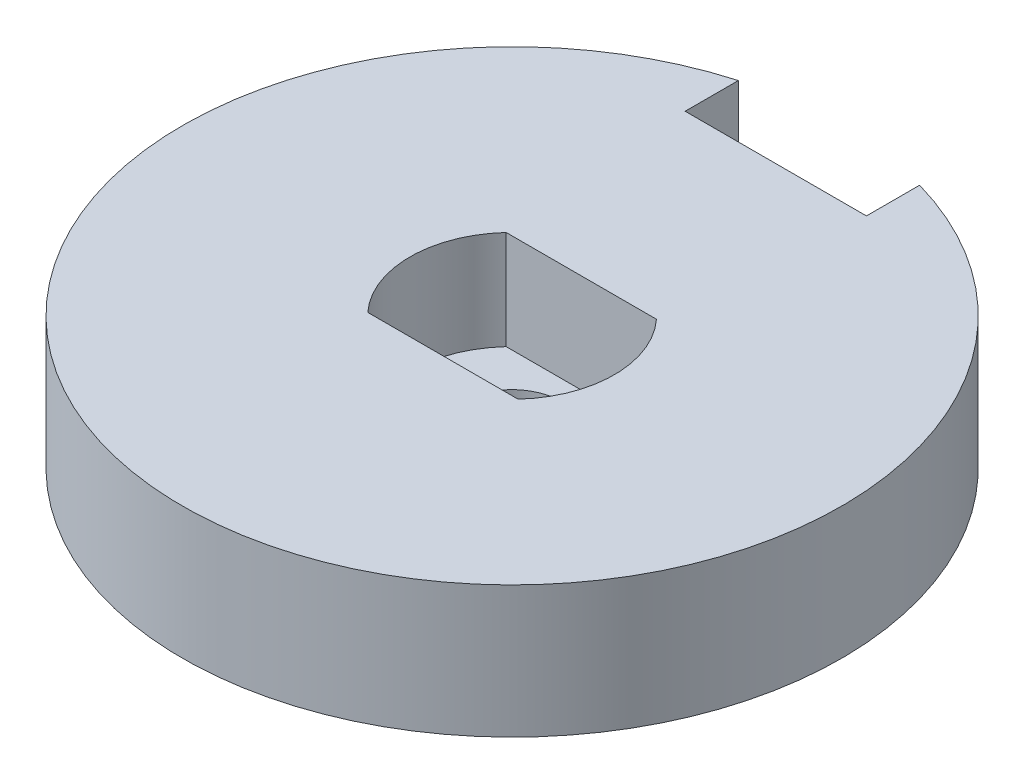
ISO-10303-21;
HEADER;
FILE_DESCRIPTION(('STEP AP214'),'2;1');
FILE_NAME('part.step','',(''),(''),'','','');
FILE_SCHEMA(('AUTOMOTIVE_DESIGN { 1 0 10303 214 1 1 1 1 }'));
ENDSEC;
DATA;
#1=APPLICATION_CONTEXT('core data for automotive mechanical design processes');
#2=APPLICATION_PROTOCOL_DEFINITION('international standard','automotive_design',2000,#1);
#3=PRODUCT_CONTEXT('',#1,'mechanical');
#4=PRODUCT('Part','Part','',(#3));
#5=PRODUCT_RELATED_PRODUCT_CATEGORY('part','',(#4));
#6=PRODUCT_DEFINITION_FORMATION('','',#4);
#7=PRODUCT_DEFINITION_CONTEXT('part definition',#1,'design');
#8=PRODUCT_DEFINITION('design','',#6,#7);
#9=PRODUCT_DEFINITION_SHAPE('','',#8);
#10=(LENGTH_UNIT() NAMED_UNIT(*) SI_UNIT(.MILLI.,.METRE.));
#11=(NAMED_UNIT(*) PLANE_ANGLE_UNIT() SI_UNIT($,.RADIAN.));
#12=(NAMED_UNIT(*) SI_UNIT($,.STERADIAN.) SOLID_ANGLE_UNIT());
#13=UNCERTAINTY_MEASURE_WITH_UNIT(LENGTH_MEASURE(1.E-05),#10,'distance_accuracy_value','');
#14=(GEOMETRIC_REPRESENTATION_CONTEXT(3) GLOBAL_UNCERTAINTY_ASSIGNED_CONTEXT((#13)) GLOBAL_UNIT_ASSIGNED_CONTEXT((#10,
#11,#12)) REPRESENTATION_CONTEXT('',''));
#15=CARTESIAN_POINT('',(0.,0.,0.));
#16=DIRECTION('',(0.,0.,1.));
#17=DIRECTION('',(1.,0.,0.));
#18=AXIS2_PLACEMENT_3D('',#15,#16,#17);
#19=CARTESIAN_POINT('',(0.,3.5,0.));
#20=DIRECTION('',(0.,1.,0.));
#21=DIRECTION('',(0.,0.,1.));
#22=AXIS2_PLACEMENT_3D('',#19,#20,#21);
#23=PLANE('',#22);
#24=DIRECTION('',(0.684347525543312,0.,0.729155994477687));
#25=VECTOR('',#24,1.);
#26=CARTESIAN_POINT('',(-3.37279266770812,3.5,0.790107347551172));
#27=LINE('',#26,#25);
#28=CARTESIAN_POINT('',(-3.37279266770812,3.5,0.790107347551172));
#29=VERTEX_POINT('',#28);
#30=CARTESIAN_POINT('',(-1.002143299158,3.5,3.3159778057087));
#31=VERTEX_POINT('',#30);
#32=EDGE_CURVE('E270',#29,#31,#27,.T.);
#33=ORIENTED_EDGE('',*,*,#32,.T.);
#34=DIRECTION('',(0.973641377311039,0.,-0.228084344898685));
#35=VECTOR('',#34,1.);
#36=CARTESIAN_POINT('',(-1.002143299158,3.5,3.3159778057087));
#37=LINE('',#36,#35);
#38=CARTESIAN_POINT('',(2.37064936855012,3.5,2.52587045815753));
#39=VERTEX_POINT('',#38);
#40=EDGE_CURVE('E254',#31,#39,#37,.T.);
#41=ORIENTED_EDGE('',*,*,#40,.T.);
#42=DIRECTION('',(0.289293851767726,0.,-0.957240339376373));
#43=VECTOR('',#42,1.);
#44=CARTESIAN_POINT('',(2.37064936855012,3.5,2.52587045815753));
#45=LINE('',#44,#43);
#46=CARTESIAN_POINT('',(3.37279266770812,3.5,-0.790107347551173));
#47=VERTEX_POINT('',#46);
#48=EDGE_CURVE('E257',#39,#47,#45,.T.);
#49=ORIENTED_EDGE('',*,*,#48,.T.);
#50=DIRECTION('',(-0.684347525543313,0.,-0.729155994477687));
#51=VECTOR('',#50,1.);
#52=CARTESIAN_POINT('',(3.37279266770812,3.5,-0.790107347551173));
#53=LINE('',#52,#51);
#54=CARTESIAN_POINT('',(1.002143299158,3.5,-3.3159778057087));
#55=VERTEX_POINT('',#54);
#56=EDGE_CURVE('E261',#47,#55,#53,.T.);
#57=ORIENTED_EDGE('',*,*,#56,.T.);
#58=DIRECTION('',(-0.973641377311039,0.,0.228084344898685));
#59=VECTOR('',#58,1.);
#60=CARTESIAN_POINT('',(1.002143299158,3.5,-3.3159778057087));
#61=LINE('',#60,#59);
#62=CARTESIAN_POINT('',(-2.37064936855011,3.5,-2.52587045815753));
#63=VERTEX_POINT('',#62);
#64=EDGE_CURVE('E264',#55,#63,#61,.T.);
#65=ORIENTED_EDGE('',*,*,#64,.T.);
#66=DIRECTION('',(-0.289293851767727,0.,0.957240339376372));
#67=VECTOR('',#66,1.);
#68=CARTESIAN_POINT('',(-2.37064936855011,3.5,-2.52587045815753));
#69=LINE('',#68,#67);
#70=EDGE_CURVE('E267',#63,#29,#69,.T.);
#71=ORIENTED_EDGE('',*,*,#70,.T.);
#72=EDGE_LOOP('',(#33,#41,#49,#57,#65,#71));
#73=FACE_BOUND('',#72,.T.);
#74=DIRECTION('',(0.,0.,1.));
#75=VECTOR('',#74,1.);
#76=CARTESIAN_POINT('',(-2.,3.5,-3.5));
#77=LINE('',#76,#75);
#78=CARTESIAN_POINT('',(-2.,3.5,-8.));
#79=VERTEX_POINT('',#78);
#80=CARTESIAN_POINT('',(-2.,3.5,-3.5));
#81=VERTEX_POINT('',#80);
#82=EDGE_CURVE('E372',#79,#81,#77,.T.);
#83=ORIENTED_EDGE('',*,*,#82,.T.);
#84=DIRECTION('',(1.,0.,0.));
#85=VECTOR('',#84,1.);
#86=CARTESIAN_POINT('',(-2.,3.5,-3.5));
#87=LINE('',#86,#85);
#88=CARTESIAN_POINT('',(2.,3.5,-3.5));
#89=VERTEX_POINT('',#88);
#90=EDGE_CURVE('E378',#81,#89,#87,.T.);
#91=ORIENTED_EDGE('',*,*,#90,.T.);
#92=DIRECTION('',(0.,0.,-1.));
#93=VECTOR('',#92,1.);
#94=CARTESIAN_POINT('',(2.,3.5,-3.5));
#95=LINE('',#94,#93);
#96=CARTESIAN_POINT('',(2.,3.5,-8.));
#97=VERTEX_POINT('',#96);
#98=EDGE_CURVE('E365',#89,#97,#95,.T.);
#99=ORIENTED_EDGE('',*,*,#98,.T.);
#100=DIRECTION('',(-1.,0.,0.));
#101=VECTOR('',#100,1.);
#102=CARTESIAN_POINT('',(-2.75,3.5,-8.));
#103=LINE('',#102,#101);
#104=CARTESIAN_POINT('',(2.75,3.5,-8.));
#105=VERTEX_POINT('',#104);
#106=EDGE_CURVE('E183',#105,#97,#103,.T.);
#107=ORIENTED_EDGE('',*,*,#106,.F.);
#108=DIRECTION('',(0.,0.,1.));
#109=VECTOR('',#108,1.);
#110=CARTESIAN_POINT('',(2.75,3.5,-8.));
#111=LINE('',#110,#109);
#112=CARTESIAN_POINT('',(2.75,3.5,-9.61444226151471));
#113=VERTEX_POINT('',#112);
#114=EDGE_CURVE('E224',#113,#105,#111,.T.);
#115=ORIENTED_EDGE('',*,*,#114,.F.);
#116=CARTESIAN_POINT('',(0.,3.5,0.));
#117=DIRECTION('',(0.,1.,0.));
#118=DIRECTION('',(0.,0.,1.));
#119=AXIS2_PLACEMENT_3D('',#116,#117,#118);
#120=CIRCLE('',#119,10.);
#121=CARTESIAN_POINT('',(-2.75,3.5,-9.61444226151471));
#122=VERTEX_POINT('',#121);
#123=EDGE_CURVE('E229',#122,#113,#120,.T.);
#124=ORIENTED_EDGE('',*,*,#123,.F.);
#125=DIRECTION('',(0.,0.,-1.));
#126=VECTOR('',#125,1.);
#127=CARTESIAN_POINT('',(-2.75,3.5,-8.));
#128=LINE('',#127,#126);
#129=CARTESIAN_POINT('',(-2.75,3.5,-8.));
#130=VERTEX_POINT('',#129);
#131=EDGE_CURVE('E240',#130,#122,#128,.T.);
#132=ORIENTED_EDGE('',*,*,#131,.F.);
#133=EDGE_CURVE('E238',#79,#130,#103,.T.);
#134=ORIENTED_EDGE('',*,*,#133,.F.);
#135=EDGE_LOOP('',(#83,#91,#99,#107,#115,#124,#132,#134));
#136=FACE_BOUND('',#135,.T.);
#137=ADVANCED_FACE('F37',(#73,#136),#23,.F.);
#138=CARTESIAN_POINT('',(-2.75,7.5,-8.));
#139=DIRECTION('',(0.,0.,1.));
#140=DIRECTION('',(1.,0.,0.));
#141=AXIS2_PLACEMENT_3D('',#138,#139,#140);
#142=PLANE('',#141);
#143=DIRECTION('',(0.,-1.,0.));
#144=VECTOR('',#143,1.);
#145=CARTESIAN_POINT('',(-2.75,7.5,-8.));
#146=LINE('',#145,#144);
#147=CARTESIAN_POINT('',(-2.75,7.5,-8.));
#148=VERTEX_POINT('',#147);
#149=EDGE_CURVE('E248',#148,#130,#146,.T.);
#150=ORIENTED_EDGE('',*,*,#149,.F.);
#151=DIRECTION('',(-1.,0.,0.));
#152=VECTOR('',#151,1.);
#153=CARTESIAN_POINT('',(-2.75,7.5,-8.));
#154=LINE('',#153,#152);
#155=CARTESIAN_POINT('',(2.75,7.5,-8.));
#156=VERTEX_POINT('',#155);
#157=EDGE_CURVE('E228',#156,#148,#154,.T.);
#158=ORIENTED_EDGE('',*,*,#157,.F.);
#159=DIRECTION('',(0.,-1.,0.));
#160=VECTOR('',#159,1.);
#161=CARTESIAN_POINT('',(2.75,7.5,-8.));
#162=LINE('',#161,#160);
#163=EDGE_CURVE('E251',#156,#105,#162,.T.);
#164=ORIENTED_EDGE('',*,*,#163,.T.);
#165=ORIENTED_EDGE('',*,*,#106,.T.);
#166=DIRECTION('',(0.,-1.,0.));
#167=VECTOR('',#166,1.);
#168=CARTESIAN_POINT('',(2.,4.4,-8.));
#169=LINE('',#168,#167);
#170=CARTESIAN_POINT('',(2.,4.4,-8.));
#171=VERTEX_POINT('',#170);
#172=EDGE_CURVE('E168',#171,#97,#169,.T.);
#173=ORIENTED_EDGE('',*,*,#172,.F.);
#174=DIRECTION('',(-1.,0.,0.));
#175=VECTOR('',#174,1.);
#176=CARTESIAN_POINT('',(2.,4.4,-8.));
#177=LINE('',#176,#175);
#178=CARTESIAN_POINT('',(-2.,4.4,-8.));
#179=VERTEX_POINT('',#178);
#180=EDGE_CURVE('E172',#171,#179,#177,.T.);
#181=ORIENTED_EDGE('',*,*,#180,.T.);
#182=DIRECTION('',(0.,-1.,0.));
#183=VECTOR('',#182,1.);
#184=CARTESIAN_POINT('',(-2.,4.4,-8.));
#185=LINE('',#184,#183);
#186=EDGE_CURVE('E184',#179,#79,#185,.T.);
#187=ORIENTED_EDGE('',*,*,#186,.T.);
#188=ORIENTED_EDGE('',*,*,#133,.T.);
#189=EDGE_LOOP('',(#150,#158,#164,#165,#173,#181,#187,#188));
#190=FACE_BOUND('',#189,.T.);
#191=ADVANCED_FACE('F181',(#190),#142,.F.);
#192=CARTESIAN_POINT('',(-1.002143299158,3.5,3.3159778057087));
#193=DIRECTION('',(-0.228084344898685,0.,-0.973641377311039));
#194=DIRECTION('',(-0.973641377311039,0.,0.228084344898685));
#195=AXIS2_PLACEMENT_3D('',#192,#193,#194);
#196=PLANE('',#195);
#197=DIRECTION('',(0.973641377311039,0.,-0.228084344898685));
#198=VECTOR('',#197,1.);
#199=CARTESIAN_POINT('',(-1.002143299158,0.,3.3159778057087));
#200=LINE('',#199,#198);
#201=CARTESIAN_POINT('',(-1.002143299158,0.,3.3159778057087));
#202=VERTEX_POINT('',#201);
#203=CARTESIAN_POINT('',(2.37064936855012,0.,2.52587045815753));
#204=VERTEX_POINT('',#203);
#205=EDGE_CURVE('E253',#202,#204,#200,.T.);
#206=ORIENTED_EDGE('',*,*,#205,.T.);
#207=DIRECTION('',(0.,-1.,0.));
#208=VECTOR('',#207,1.);
#209=CARTESIAN_POINT('',(2.37064936855012,3.5,2.52587045815753));
#210=LINE('',#209,#208);
#211=EDGE_CURVE('E11',#39,#204,#210,.T.);
#212=ORIENTED_EDGE('',*,*,#211,.F.);
#213=ORIENTED_EDGE('',*,*,#40,.F.);
#214=DIRECTION('',(0.,-1.,0.));
#215=VECTOR('',#214,1.);
#216=CARTESIAN_POINT('',(-1.002143299158,3.5,3.3159778057087));
#217=LINE('',#216,#215);
#218=EDGE_CURVE('E273',#31,#202,#217,.T.);
#219=ORIENTED_EDGE('',*,*,#218,.T.);
#220=EDGE_LOOP('',(#206,#212,#213,#219));
#221=FACE_BOUND('',#220,.T.);
#222=ADVANCED_FACE('F39',(#221),#196,.F.);
#223=CARTESIAN_POINT('',(2.37064936855012,3.5,2.52587045815753));
#224=DIRECTION('',(-0.957240339376373,0.,-0.289293851767726));
#225=DIRECTION('',(-0.289293851767726,0.,0.957240339376373));
#226=AXIS2_PLACEMENT_3D('',#223,#224,#225);
#227=PLANE('',#226);
#228=DIRECTION('',(0.289293851767726,0.,-0.957240339376373));
#229=VECTOR('',#228,1.);
#230=CARTESIAN_POINT('',(2.37064936855012,0.,2.52587045815753));
#231=LINE('',#230,#229);
#232=CARTESIAN_POINT('',(3.37279266770812,0.,-0.790107347551173));
#233=VERTEX_POINT('',#232);
#234=EDGE_CURVE('E276',#204,#233,#231,.T.);
#235=ORIENTED_EDGE('',*,*,#234,.T.);
#236=DIRECTION('',(0.,-1.,0.));
#237=VECTOR('',#236,1.);
#238=CARTESIAN_POINT('',(3.37279266770812,3.5,-0.790107347551173));
#239=LINE('',#238,#237);
#240=EDGE_CURVE('E46',#47,#233,#239,.T.);
#241=ORIENTED_EDGE('',*,*,#240,.F.);
#242=ORIENTED_EDGE('',*,*,#48,.F.);
#243=ORIENTED_EDGE('',*,*,#211,.T.);
#244=EDGE_LOOP('',(#235,#241,#242,#243));
#245=FACE_BOUND('',#244,.T.);
#246=ADVANCED_FACE('F318',(#245),#227,.F.);
#247=CARTESIAN_POINT('',(3.37279266770812,3.5,-0.790107347551173));
#248=DIRECTION('',(-0.729155994477687,0.,0.684347525543313));
#249=DIRECTION('',(0.684347525543313,0.,0.729155994477687));
#250=AXIS2_PLACEMENT_3D('',#247,#248,#249);
#251=PLANE('',#250);
#252=DIRECTION('',(-0.684347525543313,0.,-0.729155994477687));
#253=VECTOR('',#252,1.);
#254=CARTESIAN_POINT('',(3.37279266770812,0.,-0.790107347551173));
#255=LINE('',#254,#253);
#256=CARTESIAN_POINT('',(1.002143299158,0.,-3.3159778057087));
#257=VERTEX_POINT('',#256);
#258=EDGE_CURVE('E278',#233,#257,#255,.T.);
#259=ORIENTED_EDGE('',*,*,#258,.T.);
#260=DIRECTION('',(0.,-1.,0.));
#261=VECTOR('',#260,1.);
#262=CARTESIAN_POINT('',(1.002143299158,3.5,-3.3159778057087));
#263=LINE('',#262,#261);
#264=EDGE_CURVE('E293',#55,#257,#263,.T.);
#265=ORIENTED_EDGE('',*,*,#264,.F.);
#266=ORIENTED_EDGE('',*,*,#56,.F.);
#267=ORIENTED_EDGE('',*,*,#240,.T.);
#268=EDGE_LOOP('',(#259,#265,#266,#267));
#269=FACE_BOUND('',#268,.T.);
#270=ADVANCED_FACE('F300',(#269),#251,.F.);
#271=CARTESIAN_POINT('',(1.002143299158,3.5,-3.3159778057087));
#272=DIRECTION('',(0.228084344898685,0.,0.973641377311039));
#273=DIRECTION('',(0.97364137731104,0.,-0.228084344898685));
#274=AXIS2_PLACEMENT_3D('',#271,#272,#273);
#275=PLANE('',#274);
#276=DIRECTION('',(-0.973641377311039,0.,0.228084344898685));
#277=VECTOR('',#276,1.);
#278=CARTESIAN_POINT('',(1.002143299158,0.,-3.3159778057087));
#279=LINE('',#278,#277);
#280=CARTESIAN_POINT('',(-2.37064936855011,0.,-2.52587045815753));
#281=VERTEX_POINT('',#280);
#282=EDGE_CURVE('E280',#257,#281,#279,.T.);
#283=ORIENTED_EDGE('',*,*,#282,.T.);
#284=DIRECTION('',(0.,-1.,0.));
#285=VECTOR('',#284,1.);
#286=CARTESIAN_POINT('',(-2.37064936855011,3.5,-2.52587045815753));
#287=LINE('',#286,#285);
#288=EDGE_CURVE('E290',#63,#281,#287,.T.);
#289=ORIENTED_EDGE('',*,*,#288,.F.);
#290=ORIENTED_EDGE('',*,*,#64,.F.);
#291=ORIENTED_EDGE('',*,*,#264,.T.);
#292=EDGE_LOOP('',(#283,#289,#290,#291));
#293=FACE_BOUND('',#292,.T.);
#294=ADVANCED_FACE('F309',(#293),#275,.F.);
#295=CARTESIAN_POINT('',(-2.37064936855011,3.5,-2.52587045815753));
#296=DIRECTION('',(0.957240339376372,0.,0.289293851767727));
#297=DIRECTION('',(0.289293851767727,0.,-0.957240339376373));
#298=AXIS2_PLACEMENT_3D('',#295,#296,#297);
#299=PLANE('',#298);
#300=DIRECTION('',(-0.289293851767727,0.,0.957240339376372));
#301=VECTOR('',#300,1.);
#302=CARTESIAN_POINT('',(-2.37064936855011,0.,-2.52587045815753));
#303=LINE('',#302,#301);
#304=CARTESIAN_POINT('',(-3.37279266770812,0.,0.790107347551172));
#305=VERTEX_POINT('',#304);
#306=EDGE_CURVE('E282',#281,#305,#303,.T.);
#307=ORIENTED_EDGE('',*,*,#306,.T.);
#308=DIRECTION('',(0.,-1.,0.));
#309=VECTOR('',#308,1.);
#310=CARTESIAN_POINT('',(-3.37279266770812,3.5,0.790107347551172));
#311=LINE('',#310,#309);
#312=EDGE_CURVE('E287',#29,#305,#311,.T.);
#313=ORIENTED_EDGE('',*,*,#312,.F.);
#314=ORIENTED_EDGE('',*,*,#70,.F.);
#315=ORIENTED_EDGE('',*,*,#288,.T.);
#316=EDGE_LOOP('',(#307,#313,#314,#315));
#317=FACE_BOUND('',#316,.T.);
#318=ADVANCED_FACE('F313',(#317),#299,.F.);
#319=CARTESIAN_POINT('',(-3.37279266770812,3.5,0.790107347551172));
#320=DIRECTION('',(0.729155994477687,0.,-0.684347525543312));
#321=DIRECTION('',(-0.684347525543313,0.,-0.729155994477687));
#322=AXIS2_PLACEMENT_3D('',#319,#320,#321);
#323=PLANE('',#322);
#324=DIRECTION('',(0.684347525543312,0.,0.729155994477687));
#325=VECTOR('',#324,1.);
#326=CARTESIAN_POINT('',(-3.37279266770812,0.,0.790107347551172));
#327=LINE('',#326,#325);
#328=EDGE_CURVE('E258',#305,#202,#327,.T.);
#329=ORIENTED_EDGE('',*,*,#328,.T.);
#330=ORIENTED_EDGE('',*,*,#218,.F.);
#331=ORIENTED_EDGE('',*,*,#32,.F.);
#332=ORIENTED_EDGE('',*,*,#312,.T.);
#333=EDGE_LOOP('',(#329,#330,#331,#332));
#334=FACE_BOUND('',#333,.T.);
#335=ADVANCED_FACE('F322',(#334),#323,.F.);
#336=CARTESIAN_POINT('',(0.,0.,0.));
#337=DIRECTION('',(0.,1.,0.));
#338=DIRECTION('',(0.,0.,1.));
#339=AXIS2_PLACEMENT_3D('',#336,#337,#338);
#340=PLANE('',#339);
#341=CARTESIAN_POINT('',(0.,0.,0.));
#342=DIRECTION('',(0.,-1.,0.));
#343=DIRECTION('',(0.,0.,-1.));
#344=AXIS2_PLACEMENT_3D('',#341,#342,#343);
#345=CIRCLE('',#344,1.5);
#346=CARTESIAN_POINT('',(0.,0.,-1.5));
#347=VERTEX_POINT('',#346);
#348=EDGE_CURVE('E216',#347,#347,#345,.T.);
#349=ORIENTED_EDGE('',*,*,#348,.F.);
#350=EDGE_LOOP('',(#349));
#351=FACE_BOUND('',#350,.T.);
#352=ORIENTED_EDGE('',*,*,#205,.F.);
#353=ORIENTED_EDGE('',*,*,#328,.F.);
#354=ORIENTED_EDGE('',*,*,#306,.F.);
#355=ORIENTED_EDGE('',*,*,#282,.F.);
#356=ORIENTED_EDGE('',*,*,#258,.F.);
#357=ORIENTED_EDGE('',*,*,#234,.F.);
#358=EDGE_LOOP('',(#352,#353,#354,#355,#356,#357));
#359=FACE_BOUND('',#358,.T.);
#360=ADVANCED_FACE('F305',(#351,#359),#340,.F.);
#361=CARTESIAN_POINT('',(2.75,7.5,-8.));
#362=DIRECTION('',(1.,0.,0.));
#363=DIRECTION('',(0.,0.,-1.));
#364=AXIS2_PLACEMENT_3D('',#361,#362,#363);
#365=PLANE('',#364);
#366=ORIENTED_EDGE('',*,*,#114,.T.);
#367=ORIENTED_EDGE('',*,*,#163,.F.);
#368=DIRECTION('',(0.,0.,1.));
#369=VECTOR('',#368,1.);
#370=CARTESIAN_POINT('',(2.75,7.5,-8.));
#371=LINE('',#370,#369);
#372=CARTESIAN_POINT('',(2.75,7.5,-9.61444226151471));
#373=VERTEX_POINT('',#372);
#374=EDGE_CURVE('E225',#373,#156,#371,.T.);
#375=ORIENTED_EDGE('',*,*,#374,.F.);
#376=DIRECTION('',(0.,-1.,0.));
#377=VECTOR('',#376,1.);
#378=CARTESIAN_POINT('',(2.75,7.5,-9.61444226151471));
#379=LINE('',#378,#377);
#380=EDGE_CURVE('E235',#373,#113,#379,.T.);
#381=ORIENTED_EDGE('',*,*,#380,.T.);
#382=EDGE_LOOP('',(#366,#367,#375,#381));
#383=FACE_BOUND('',#382,.T.);
#384=ADVANCED_FACE('F329',(#383),#365,.F.);
#385=CARTESIAN_POINT('',(-2.75,7.5,-8.));
#386=DIRECTION('',(-1.,0.,0.));
#387=DIRECTION('',(0.,0.,1.));
#388=AXIS2_PLACEMENT_3D('',#385,#386,#387);
#389=PLANE('',#388);
#390=ORIENTED_EDGE('',*,*,#131,.T.);
#391=DIRECTION('',(0.,-1.,0.));
#392=VECTOR('',#391,1.);
#393=CARTESIAN_POINT('',(-2.75,7.5,-9.61444226151471));
#394=LINE('',#393,#392);
#395=CARTESIAN_POINT('',(-2.75,7.5,-9.61444226151471));
#396=VERTEX_POINT('',#395);
#397=EDGE_CURVE('E245',#396,#122,#394,.T.);
#398=ORIENTED_EDGE('',*,*,#397,.F.);
#399=DIRECTION('',(0.,0.,-1.));
#400=VECTOR('',#399,1.);
#401=CARTESIAN_POINT('',(-2.75,7.5,-8.));
#402=LINE('',#401,#400);
#403=EDGE_CURVE('E231',#148,#396,#402,.T.);
#404=ORIENTED_EDGE('',*,*,#403,.F.);
#405=ORIENTED_EDGE('',*,*,#149,.T.);
#406=EDGE_LOOP('',(#390,#398,#404,#405));
#407=FACE_BOUND('',#406,.T.);
#408=ADVANCED_FACE('F348',(#407),#389,.F.);
#409=CARTESIAN_POINT('',(0.,7.5,0.));
#410=DIRECTION('',(0.,-1.,0.));
#411=DIRECTION('',(0.,0.,-1.));
#412=AXIS2_PLACEMENT_3D('',#409,#410,#411);
#413=CYLINDRICAL_SURFACE('',#412,10.);
#414=ORIENTED_EDGE('',*,*,#123,.T.);
#415=ORIENTED_EDGE('',*,*,#380,.F.);
#416=CARTESIAN_POINT('',(0.,7.5,0.));
#417=DIRECTION('',(0.,1.,0.));
#418=DIRECTION('',(0.,0.,1.));
#419=AXIS2_PLACEMENT_3D('',#416,#417,#418);
#420=CIRCLE('',#419,10.);
#421=EDGE_CURVE('E233',#396,#373,#420,.T.);
#422=ORIENTED_EDGE('',*,*,#421,.F.);
#423=ORIENTED_EDGE('',*,*,#397,.T.);
#424=EDGE_LOOP('',(#414,#415,#422,#423));
#425=FACE_BOUND('',#424,.T.);
#426=ADVANCED_FACE('F345',(#425),#413,.T.);
#427=CARTESIAN_POINT('',(0.,7.5,0.));
#428=DIRECTION('',(0.,1.,0.));
#429=DIRECTION('',(0.,0.,1.));
#430=AXIS2_PLACEMENT_3D('',#427,#428,#429);
#431=PLANE('',#430);
#432=ORIENTED_EDGE('',*,*,#157,.T.);
#433=ORIENTED_EDGE('',*,*,#403,.T.);
#434=ORIENTED_EDGE('',*,*,#421,.T.);
#435=ORIENTED_EDGE('',*,*,#374,.T.);
#436=EDGE_LOOP('',(#432,#433,#434,#435));
#437=FACE_BOUND('',#436,.T.);
#438=CARTESIAN_POINT('',(0.,7.5,0.));
#439=DIRECTION('',(0.,1.,0.));
#440=DIRECTION('',(0.,0.,1.));
#441=AXIS2_PLACEMENT_3D('',#438,#439,#440);
#442=CIRCLE('',#441,3.1);
#443=CARTESIAN_POINT('',(-2.28035085019828,7.5,-2.1));
#444=VERTEX_POINT('',#443);
#445=CARTESIAN_POINT('',(-2.28035085019828,7.5,2.1));
#446=VERTEX_POINT('',#445);
#447=EDGE_CURVE('E61',#444,#446,#442,.T.);
#448=ORIENTED_EDGE('',*,*,#447,.F.);
#449=DIRECTION('',(-1.,0.,0.));
#450=VECTOR('',#449,1.);
#451=CARTESIAN_POINT('',(-2.28035085019828,7.5,-2.1));
#452=LINE('',#451,#450);
#453=CARTESIAN_POINT('',(2.28035085019828,7.5,-2.1));
#454=VERTEX_POINT('',#453);
#455=EDGE_CURVE('E195',#454,#444,#452,.T.);
#456=ORIENTED_EDGE('',*,*,#455,.F.);
#457=CARTESIAN_POINT('',(0.,7.5,0.));
#458=DIRECTION('',(0.,1.,0.));
#459=DIRECTION('',(0.,0.,1.));
#460=AXIS2_PLACEMENT_3D('',#457,#458,#459);
#461=CIRCLE('',#460,3.1);
#462=CARTESIAN_POINT('',(2.28035085019828,7.5,2.1));
#463=VERTEX_POINT('',#462);
#464=EDGE_CURVE('E209',#463,#454,#461,.T.);
#465=ORIENTED_EDGE('',*,*,#464,.F.);
#466=DIRECTION('',(1.,0.,0.));
#467=VECTOR('',#466,1.);
#468=CARTESIAN_POINT('',(-2.28035085019828,7.5,2.1));
#469=LINE('',#468,#467);
#470=EDGE_CURVE('E206',#446,#463,#469,.T.);
#471=ORIENTED_EDGE('',*,*,#470,.F.);
#472=EDGE_LOOP('',(#448,#456,#465,#471));
#473=FACE_BOUND('',#472,.T.);
#474=ADVANCED_FACE('F343',(#437,#473),#431,.T.);
#475=CARTESIAN_POINT('',(0.,4.,0.));
#476=DIRECTION('',(0.,-1.,0.));
#477=DIRECTION('',(0.,0.,-1.));
#478=AXIS2_PLACEMENT_3D('',#475,#476,#477);
#479=CYLINDRICAL_SURFACE('',#478,1.5);
#480=ORIENTED_EDGE('',*,*,#348,.T.);
#481=EDGE_LOOP('',(#480));
#482=FACE_BOUND('',#481,.T.);
#483=CARTESIAN_POINT('',(0.,4.5,0.));
#484=DIRECTION('',(0.,1.,0.));
#485=DIRECTION('',(0.,0.,1.));
#486=AXIS2_PLACEMENT_3D('',#483,#484,#485);
#487=CIRCLE('',#486,1.5);
#488=CARTESIAN_POINT('',(0.,4.5,1.5));
#489=VERTEX_POINT('',#488);
#490=EDGE_CURVE('E41',#489,#489,#487,.T.);
#491=ORIENTED_EDGE('',*,*,#490,.T.);
#492=EDGE_LOOP('',(#491));
#493=FACE_BOUND('',#492,.T.);
#494=ADVANCED_FACE('F385',(#482,#493),#479,.F.);
#495=CARTESIAN_POINT('',(0.,4.5,0.));
#496=DIRECTION('',(0.,1.,0.));
#497=DIRECTION('',(0.,0.,1.));
#498=AXIS2_PLACEMENT_3D('',#495,#496,#497);
#499=CYLINDRICAL_SURFACE('',#498,3.1);
#500=ORIENTED_EDGE('',*,*,#447,.T.);
#501=DIRECTION('',(0.,1.,0.));
#502=VECTOR('',#501,1.);
#503=CARTESIAN_POINT('',(-2.28035085019828,4.5,2.1));
#504=LINE('',#503,#502);
#505=CARTESIAN_POINT('',(-2.28035085019828,4.5,2.1));
#506=VERTEX_POINT('',#505);
#507=EDGE_CURVE('E204',#506,#446,#504,.T.);
#508=ORIENTED_EDGE('',*,*,#507,.F.);
#509=CARTESIAN_POINT('',(0.,4.5,0.));
#510=DIRECTION('',(0.,1.,0.));
#511=DIRECTION('',(0.,0.,1.));
#512=AXIS2_PLACEMENT_3D('',#509,#510,#511);
#513=CIRCLE('',#512,3.1);
#514=CARTESIAN_POINT('',(-2.28035085019828,4.5,-2.1));
#515=VERTEX_POINT('',#514);
#516=EDGE_CURVE('E191',#515,#506,#513,.T.);
#517=ORIENTED_EDGE('',*,*,#516,.F.);
#518=DIRECTION('',(0.,1.,0.));
#519=VECTOR('',#518,1.);
#520=CARTESIAN_POINT('',(-2.28035085019828,4.5,-2.1));
#521=LINE('',#520,#519);
#522=EDGE_CURVE('E214',#515,#444,#521,.T.);
#523=ORIENTED_EDGE('',*,*,#522,.T.);
#524=EDGE_LOOP('',(#500,#508,#517,#523));
#525=FACE_BOUND('',#524,.T.);
#526=ADVANCED_FACE('F395',(#525),#499,.F.);
#527=CARTESIAN_POINT('',(-2.28035085019828,4.5,-2.1));
#528=DIRECTION('',(0.,0.,-1.));
#529=DIRECTION('',(-1.,0.,0.));
#530=AXIS2_PLACEMENT_3D('',#527,#528,#529);
#531=PLANE('',#530);
#532=ORIENTED_EDGE('',*,*,#455,.T.);
#533=ORIENTED_EDGE('',*,*,#522,.F.);
#534=DIRECTION('',(-1.,0.,0.));
#535=VECTOR('',#534,1.);
#536=CARTESIAN_POINT('',(-2.28035085019828,4.5,-2.1));
#537=LINE('',#536,#535);
#538=CARTESIAN_POINT('',(2.28035085019828,4.5,-2.1));
#539=VERTEX_POINT('',#538);
#540=EDGE_CURVE('E201',#539,#515,#537,.T.);
#541=ORIENTED_EDGE('',*,*,#540,.F.);
#542=DIRECTION('',(0.,1.,0.));
#543=VECTOR('',#542,1.);
#544=CARTESIAN_POINT('',(2.28035085019828,4.5,-2.1));
#545=LINE('',#544,#543);
#546=EDGE_CURVE('E217',#539,#454,#545,.T.);
#547=ORIENTED_EDGE('',*,*,#546,.T.);
#548=EDGE_LOOP('',(#532,#533,#541,#547));
#549=FACE_BOUND('',#548,.T.);
#550=ADVANCED_FACE('F403',(#549),#531,.F.);
#551=CARTESIAN_POINT('',(0.,4.5,0.));
#552=DIRECTION('',(0.,1.,0.));
#553=DIRECTION('',(0.,0.,1.));
#554=AXIS2_PLACEMENT_3D('',#551,#552,#553);
#555=CYLINDRICAL_SURFACE('',#554,3.1);
#556=ORIENTED_EDGE('',*,*,#464,.T.);
#557=ORIENTED_EDGE('',*,*,#546,.F.);
#558=CARTESIAN_POINT('',(0.,4.5,0.));
#559=DIRECTION('',(0.,1.,0.));
#560=DIRECTION('',(0.,0.,1.));
#561=AXIS2_PLACEMENT_3D('',#558,#559,#560);
#562=CIRCLE('',#561,3.1);
#563=CARTESIAN_POINT('',(2.28035085019828,4.5,2.1));
#564=VERTEX_POINT('',#563);
#565=EDGE_CURVE('E198',#564,#539,#562,.T.);
#566=ORIENTED_EDGE('',*,*,#565,.F.);
#567=DIRECTION('',(0.,1.,0.));
#568=VECTOR('',#567,1.);
#569=CARTESIAN_POINT('',(2.28035085019828,4.5,2.1));
#570=LINE('',#569,#568);
#571=EDGE_CURVE('E219',#564,#463,#570,.T.);
#572=ORIENTED_EDGE('',*,*,#571,.T.);
#573=EDGE_LOOP('',(#556,#557,#566,#572));
#574=FACE_BOUND('',#573,.T.);
#575=ADVANCED_FACE('F401',(#574),#555,.F.);
#576=CARTESIAN_POINT('',(-2.28035085019828,4.5,2.1));
#577=DIRECTION('',(0.,0.,1.));
#578=DIRECTION('',(1.,0.,0.));
#579=AXIS2_PLACEMENT_3D('',#576,#577,#578);
#580=PLANE('',#579);
#581=ORIENTED_EDGE('',*,*,#470,.T.);
#582=ORIENTED_EDGE('',*,*,#571,.F.);
#583=DIRECTION('',(1.,0.,0.));
#584=VECTOR('',#583,1.);
#585=CARTESIAN_POINT('',(-2.28035085019828,4.5,2.1));
#586=LINE('',#585,#584);
#587=EDGE_CURVE('E194',#506,#564,#586,.T.);
#588=ORIENTED_EDGE('',*,*,#587,.F.);
#589=ORIENTED_EDGE('',*,*,#507,.T.);
#590=EDGE_LOOP('',(#581,#582,#588,#589));
#591=FACE_BOUND('',#590,.T.);
#592=ADVANCED_FACE('F390',(#591),#580,.F.);
#593=CARTESIAN_POINT('',(0.,4.5,0.));
#594=DIRECTION('',(0.,1.,0.));
#595=DIRECTION('',(0.,0.,1.));
#596=AXIS2_PLACEMENT_3D('',#593,#594,#595);
#597=PLANE('',#596);
#598=ORIENTED_EDGE('',*,*,#490,.F.);
#599=EDGE_LOOP('',(#598));
#600=FACE_BOUND('',#599,.T.);
#601=ORIENTED_EDGE('',*,*,#516,.T.);
#602=ORIENTED_EDGE('',*,*,#587,.T.);
#603=ORIENTED_EDGE('',*,*,#565,.T.);
#604=ORIENTED_EDGE('',*,*,#540,.T.);
#605=EDGE_LOOP('',(#601,#602,#603,#604));
#606=FACE_BOUND('',#605,.T.);
#607=ADVANCED_FACE('F387',(#600,#606),#597,.T.);
#608=CARTESIAN_POINT('',(-2.,4.4,-3.5));
#609=DIRECTION('',(1.,0.,0.));
#610=DIRECTION('',(0.,0.,-1.));
#611=AXIS2_PLACEMENT_3D('',#608,#609,#610);
#612=PLANE('',#611);
#613=ORIENTED_EDGE('',*,*,#82,.F.);
#614=ORIENTED_EDGE('',*,*,#186,.F.);
#615=DIRECTION('',(0.,0.,1.));
#616=VECTOR('',#615,1.);
#617=CARTESIAN_POINT('',(-2.,4.4,-3.5));
#618=LINE('',#617,#616);
#619=CARTESIAN_POINT('',(-2.,4.4,-3.5));
#620=VERTEX_POINT('',#619);
#621=EDGE_CURVE('E53',#179,#620,#618,.T.);
#622=ORIENTED_EDGE('',*,*,#621,.T.);
#623=DIRECTION('',(0.,-1.,0.));
#624=VECTOR('',#623,1.);
#625=CARTESIAN_POINT('',(-2.,4.4,-3.5));
#626=LINE('',#625,#624);
#627=EDGE_CURVE('E186',#620,#81,#626,.T.);
#628=ORIENTED_EDGE('',*,*,#627,.T.);
#629=EDGE_LOOP('',(#613,#614,#622,#628));
#630=FACE_BOUND('',#629,.T.);
#631=ADVANCED_FACE('F374',(#630),#612,.T.);
#632=CARTESIAN_POINT('',(-2.,4.4,-3.5));
#633=DIRECTION('',(0.,0.,-1.));
#634=DIRECTION('',(-1.,0.,0.));
#635=AXIS2_PLACEMENT_3D('',#632,#633,#634);
#636=PLANE('',#635);
#637=ORIENTED_EDGE('',*,*,#90,.F.);
#638=ORIENTED_EDGE('',*,*,#627,.F.);
#639=DIRECTION('',(1.,0.,0.));
#640=VECTOR('',#639,1.);
#641=CARTESIAN_POINT('',(-2.,4.4,-3.5));
#642=LINE('',#641,#640);
#643=CARTESIAN_POINT('',(2.,4.4,-3.5));
#644=VERTEX_POINT('',#643);
#645=EDGE_CURVE('E171',#620,#644,#642,.T.);
#646=ORIENTED_EDGE('',*,*,#645,.T.);
#647=DIRECTION('',(0.,-1.,0.));
#648=VECTOR('',#647,1.);
#649=CARTESIAN_POINT('',(2.,4.4,-3.5));
#650=LINE('',#649,#648);
#651=EDGE_CURVE('E170',#644,#89,#650,.T.);
#652=ORIENTED_EDGE('',*,*,#651,.T.);
#653=EDGE_LOOP('',(#637,#638,#646,#652));
#654=FACE_BOUND('',#653,.T.);
#655=ADVANCED_FACE('F423',(#654),#636,.T.);
#656=CARTESIAN_POINT('',(2.,4.4,-3.5));
#657=DIRECTION('',(-1.,0.,0.));
#658=DIRECTION('',(0.,0.,1.));
#659=AXIS2_PLACEMENT_3D('',#656,#657,#658);
#660=PLANE('',#659);
#661=ORIENTED_EDGE('',*,*,#98,.F.);
#662=ORIENTED_EDGE('',*,*,#651,.F.);
#663=DIRECTION('',(0.,0.,-1.));
#664=VECTOR('',#663,1.);
#665=CARTESIAN_POINT('',(2.,4.4,-3.5));
#666=LINE('',#665,#664);
#667=EDGE_CURVE('E164',#644,#171,#666,.T.);
#668=ORIENTED_EDGE('',*,*,#667,.T.);
#669=ORIENTED_EDGE('',*,*,#172,.T.);
#670=EDGE_LOOP('',(#661,#662,#668,#669));
#671=FACE_BOUND('',#670,.T.);
#672=ADVANCED_FACE('F166',(#671),#660,.T.);
#673=CARTESIAN_POINT('',(0.,4.4,0.));
#674=DIRECTION('',(0.,-1.,0.));
#675=DIRECTION('',(0.,0.,1.));
#676=AXIS2_PLACEMENT_3D('',#673,#674,#675);
#677=PLANE('',#676);
#678=ORIENTED_EDGE('',*,*,#621,.F.);
#679=ORIENTED_EDGE('',*,*,#180,.F.);
#680=ORIENTED_EDGE('',*,*,#667,.F.);
#681=ORIENTED_EDGE('',*,*,#645,.F.);
#682=EDGE_LOOP('',(#678,#679,#680,#681));
#683=FACE_BOUND('',#682,.T.);
#684=ADVANCED_FACE('F175',(#683),#677,.T.);
#685=CLOSED_SHELL('',(#137,#191,#222,#246,#270,#294,#318,#335,#360,#384,#408,#426,#474,#494,
#526,#550,#575,#592,#607,#631,#655,#672,#684));
#686=MANIFOLD_SOLID_BREP('B2',#685);
#687=ADVANCED_BREP_SHAPE_REPRESENTATION('',(#18,#686),#14);
#688=SHAPE_DEFINITION_REPRESENTATION(#9,#687);
ENDSEC;
END-ISO-10303-21;
